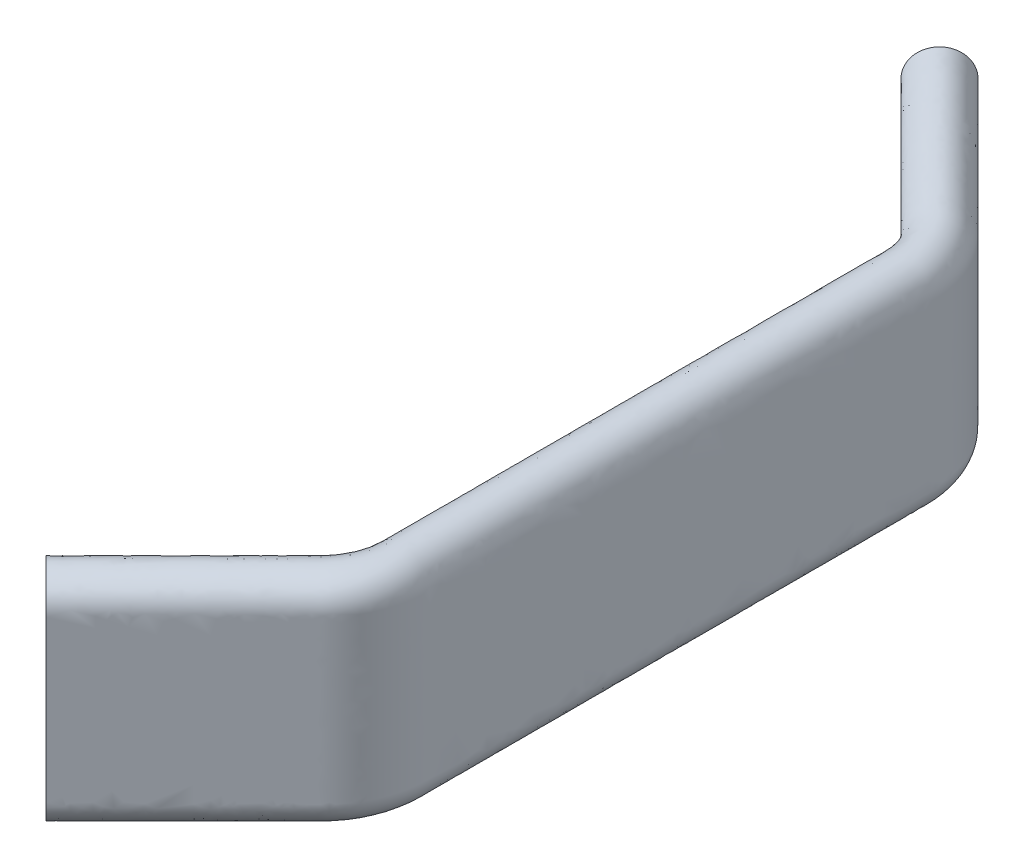
ISO-10303-21;
HEADER;
FILE_DESCRIPTION(('STEP AP214'),'2;1');
FILE_NAME('part.step','',(''),(''),'','','');
FILE_SCHEMA(('AUTOMOTIVE_DESIGN { 1 0 10303 214 1 1 1 1 }'));
ENDSEC;
DATA;
#1=APPLICATION_CONTEXT('core data for automotive mechanical design processes');
#2=APPLICATION_PROTOCOL_DEFINITION('international standard','automotive_design',2000,#1);
#3=PRODUCT_CONTEXT('',#1,'mechanical');
#4=PRODUCT('Part','Part','',(#3));
#5=PRODUCT_RELATED_PRODUCT_CATEGORY('part','',(#4));
#6=PRODUCT_DEFINITION_FORMATION('','',#4);
#7=PRODUCT_DEFINITION_CONTEXT('part definition',#1,'design');
#8=PRODUCT_DEFINITION('design','',#6,#7);
#9=PRODUCT_DEFINITION_SHAPE('','',#8);
#10=(LENGTH_UNIT() NAMED_UNIT(*) SI_UNIT(.MILLI.,.METRE.));
#11=(NAMED_UNIT(*) PLANE_ANGLE_UNIT() SI_UNIT($,.RADIAN.));
#12=(NAMED_UNIT(*) SI_UNIT($,.STERADIAN.) SOLID_ANGLE_UNIT());
#13=UNCERTAINTY_MEASURE_WITH_UNIT(LENGTH_MEASURE(1.E-05),#10,'distance_accuracy_value','');
#14=(GEOMETRIC_REPRESENTATION_CONTEXT(3) GLOBAL_UNCERTAINTY_ASSIGNED_CONTEXT((#13)) GLOBAL_UNIT_ASSIGNED_CONTEXT((#10,
#11,#12)) REPRESENTATION_CONTEXT('',''));
#15=CARTESIAN_POINT('',(0.,0.,0.));
#16=DIRECTION('',(0.,0.,1.));
#17=DIRECTION('',(1.,0.,0.));
#18=AXIS2_PLACEMENT_3D('',#15,#16,#17);
#19=CARTESIAN_POINT('',(1595.46445851633,1338.,-425.606601717802));
#20=DIRECTION('',(0.707106781186548,0.,0.707106781186548));
#21=DIRECTION('',(0.707106781186548,0.,-0.707106781186548));
#22=AXIS2_PLACEMENT_3D('',#19,#20,#21);
#23=PLANE('',#22);
#24=CARTESIAN_POINT('',(1588.39339070446,1308.,-418.535533905937));
#25=CARTESIAN_POINT('',(1588.39339070446,1318.,-418.535533905937));
#26=CARTESIAN_POINT('',(1588.39339070446,1328.,-418.535533905937));
#27=CARTESIAN_POINT('',(1588.39339070446,1338.,-418.535533905937));
#28=CARTESIAN_POINT('',(1588.39339070446,1339.308996939,-418.535533905937));
#29=CARTESIAN_POINT('',(1589.15843914151,1341.91805812446,-419.300582342983));
#30=CARTESIAN_POINT('',(1591.9289246104,1343.54097093777,-422.07106781187));
#31=CARTESIAN_POINT('',(1594.69941007928,1341.91805812446,-424.841553280756));
#32=CARTESIAN_POINT('',(1595.46445851633,1339.308996939,-425.606601717802));
#33=CARTESIAN_POINT('',(1595.46445851633,1338.,-425.606601717802));
#34=CARTESIAN_POINT('',(1595.46445851633,1328.,-425.606601717802));
#35=CARTESIAN_POINT('',(1595.46445851633,1318.,-425.606601717802));
#36=CARTESIAN_POINT('',(1595.46445851633,1308.,-425.606601717802));
#37=CARTESIAN_POINT('',(1595.46445851633,1306.69100306101,-425.606601717802));
#38=CARTESIAN_POINT('',(1594.69941007928,1304.08194187554,-424.841553280755));
#39=CARTESIAN_POINT('',(1591.9289246104,1302.45902906223,-422.07106781187));
#40=CARTESIAN_POINT('',(1589.15843914151,1304.08194187554,-419.300582342983));
#41=CARTESIAN_POINT('',(1588.39339070446,1306.69100306101,-418.535533905937));
#42=CARTESIAN_POINT('',(1588.39339070446,1308.,-418.535533905937));
#43=B_SPLINE_CURVE_WITH_KNOTS('',3,(#24,#25,#26,#27,#28,#29,#30,#31,#32,#33,#34,#35,#36,#37,#38,
#39,#40,#41,#42),.UNSPECIFIED.,.T.,.F.,(4,3,1,1,1,3,3,1,1,1,4),(0.,0.3281703871176,
0.3711277903382,0.4140851935588,0.4570425967794,0.5,0.8281703871176,0.8711277903382,
0.9140851935588,0.9570425967794,1.),.UNSPECIFIED.);
#44=CARTESIAN_POINT('',(1588.39339070446,1308.,-418.535533905937));
#45=VERTEX_POINT('',#44);
#46=EDGE_CURVE('E24',#45,#45,#43,.T.);
#47=ORIENTED_EDGE('',*,*,#46,.T.);
#48=EDGE_LOOP('',(#47));
#49=FACE_BOUND('',#48,.T.);
#50=ADVANCED_FACE('F15',(#49),#23,.F.);
#51=CARTESIAN_POINT('',(1595.46445851633,1338.,-254.393398282202));
#52=DIRECTION('',(-0.707106781186548,0.,0.707106781186548));
#53=DIRECTION('',(0.707106781186548,0.,0.707106781186548));
#54=AXIS2_PLACEMENT_3D('',#51,#52,#53);
#55=PLANE('',#54);
#56=CARTESIAN_POINT('',(1588.39339070446,1308.,-261.464466094068));
#57=CARTESIAN_POINT('',(1588.39339070446,1318.,-261.464466094068));
#58=CARTESIAN_POINT('',(1588.39339070446,1328.,-261.464466094068));
#59=CARTESIAN_POINT('',(1588.39339070446,1338.,-261.464466094068));
#60=CARTESIAN_POINT('',(1588.39339070446,1339.308996939,-261.464466094068));
#61=CARTESIAN_POINT('',(1589.15843914151,1341.91805812446,-260.699417657021));
#62=CARTESIAN_POINT('',(1591.9289246104,1343.54097093777,-257.928932188135));
#63=CARTESIAN_POINT('',(1594.69941007929,1341.91805812446,-255.158446719249));
#64=CARTESIAN_POINT('',(1595.46445851633,1339.308996939,-254.393398282202));
#65=CARTESIAN_POINT('',(1595.46445851633,1338.,-254.393398282202));
#66=CARTESIAN_POINT('',(1595.46445851633,1328.,-254.393398282202));
#67=CARTESIAN_POINT('',(1595.46445851633,1318.,-254.393398282202));
#68=CARTESIAN_POINT('',(1595.46445851633,1308.,-254.393398282202));
#69=CARTESIAN_POINT('',(1595.46445851633,1306.69100306101,-254.393398282202));
#70=CARTESIAN_POINT('',(1594.69941007929,1304.08194187554,-255.158446719249));
#71=CARTESIAN_POINT('',(1591.9289246104,1302.45902906223,-257.928932188135));
#72=CARTESIAN_POINT('',(1589.15843914151,1304.08194187554,-260.699417657021));
#73=CARTESIAN_POINT('',(1588.39339070446,1306.69100306101,-261.464466094068));
#74=CARTESIAN_POINT('',(1588.39339070446,1308.,-261.464466094068));
#75=B_SPLINE_CURVE_WITH_KNOTS('',3,(#56,#57,#58,#59,#60,#61,#62,#63,#64,#65,#66,#67,#68,#69,#70,
#71,#72,#73,#74),.UNSPECIFIED.,.T.,.F.,(4,3,1,1,1,3,3,1,1,1,4),(0.,0.3281703871176,
0.3711277903382,0.4140851935588,0.4570425967794,0.5,0.8281703871176,0.8711277903382,
0.9140851935588,0.9570425967794,1.),.UNSPECIFIED.);
#76=CARTESIAN_POINT('',(1588.39339070446,1308.,-261.464466094068));
#77=VERTEX_POINT('',#76);
#78=EDGE_CURVE('E10',#77,#77,#75,.F.);
#79=ORIENTED_EDGE('',*,*,#78,.T.);
#80=EDGE_LOOP('',(#79));
#81=FACE_BOUND('',#80,.T.);
#82=ADVANCED_FACE('F17',(#81),#55,.T.);
#83=CARTESIAN_POINT('',(1588.39339070446,1308.,-418.535533905937));
#84=CARTESIAN_POINT('',(1596.78594721435,1308.,-410.142977396048));
#85=CARTESIAN_POINT('',(1605.17850372424,1308.,-401.750420886159));
#86=CARTESIAN_POINT('',(1613.57106023413,1308.,-393.35786437627));
#87=CARTESIAN_POINT('',(1614.03311615497,1308.,-392.895808455431));
#88=CARTESIAN_POINT('',(1614.86863115568,1308.,-391.878006064304));
#89=CARTESIAN_POINT('',(1615.79824988906,1308.,-390.138260913584));
#90=CARTESIAN_POINT('',(1616.37109577238,1308.,-388.250735609691));
#91=CARTESIAN_POINT('',(1616.49999242226,1308.,-386.940242314225));
#92=CARTESIAN_POINT('',(1616.49999242226,1308.,-386.286796564404));
#93=CARTESIAN_POINT('',(1616.49999242226,1308.,-355.428932188135));
#94=CARTESIAN_POINT('',(1616.49999242226,1308.,-324.571067811866));
#95=CARTESIAN_POINT('',(1616.49999242226,1308.,-293.713203435597));
#96=CARTESIAN_POINT('',(1616.49999242226,1308.,-293.059757685768));
#97=CARTESIAN_POINT('',(1616.37109577238,1308.,-291.749264390316));
#98=CARTESIAN_POINT('',(1615.79824988906,1308.,-289.861739086415));
#99=CARTESIAN_POINT('',(1614.86863115568,1308.,-288.121993935699));
#100=CARTESIAN_POINT('',(1614.03311615497,1308.,-287.104191544571));
#101=CARTESIAN_POINT('',(1613.57106023413,1308.,-286.642135623732));
#102=CARTESIAN_POINT('',(1605.17850372424,1308.,-278.249579113844));
#103=CARTESIAN_POINT('',(1596.78594721436,1308.,-269.857022603956));
#104=CARTESIAN_POINT('',(1588.39339070446,1308.,-261.464466094068));
#105=CARTESIAN_POINT('',(1588.39339070446,1318.,-418.535533905937));
#106=CARTESIAN_POINT('',(1596.78594721435,1318.,-410.142977396048));
#107=CARTESIAN_POINT('',(1605.17850372424,1318.,-401.750420886159));
#108=CARTESIAN_POINT('',(1613.57106023413,1318.,-393.35786437627));
#109=CARTESIAN_POINT('',(1614.03311615497,1318.,-392.895808455429));
#110=CARTESIAN_POINT('',(1614.86863115568,1318.,-391.878006064304));
#111=CARTESIAN_POINT('',(1615.79824988906,1318.,-390.138260913584));
#112=CARTESIAN_POINT('',(1616.37109577238,1318.,-388.25073560969));
#113=CARTESIAN_POINT('',(1616.49999242226,1318.,-386.940242314227));
#114=CARTESIAN_POINT('',(1616.49999242226,1318.,-386.286796564404));
#115=CARTESIAN_POINT('',(1616.49999242226,1318.,-355.428932188135));
#116=CARTESIAN_POINT('',(1616.49999242226,1318.,-324.571067811866));
#117=CARTESIAN_POINT('',(1616.49999242226,1318.,-293.713203435597));
#118=CARTESIAN_POINT('',(1616.49999242226,1318.,-293.059757685769));
#119=CARTESIAN_POINT('',(1616.37109577238,1318.,-291.749264390315));
#120=CARTESIAN_POINT('',(1615.79824988906,1318.,-289.861739086415));
#121=CARTESIAN_POINT('',(1614.86863115568,1318.,-288.121993935699));
#122=CARTESIAN_POINT('',(1614.03311615497,1318.,-287.104191544571));
#123=CARTESIAN_POINT('',(1613.57106023413,1318.,-286.642135623732));
#124=CARTESIAN_POINT('',(1605.17850372424,1318.,-278.249579113844));
#125=CARTESIAN_POINT('',(1596.78594721436,1318.,-269.857022603956));
#126=CARTESIAN_POINT('',(1588.39339070446,1318.,-261.464466094068));
#127=CARTESIAN_POINT('',(1588.39339070446,1328.,-418.535533905937));
#128=CARTESIAN_POINT('',(1596.78594721435,1328.,-410.142977396048));
#129=CARTESIAN_POINT('',(1605.17850372424,1328.,-401.750420886159));
#130=CARTESIAN_POINT('',(1613.57106023413,1328.,-393.35786437627));
#131=CARTESIAN_POINT('',(1614.03311615497,1328.,-392.895808455427));
#132=CARTESIAN_POINT('',(1614.86863115568,1328.,-391.878006064305));
#133=CARTESIAN_POINT('',(1615.79824988906,1328.,-390.138260913584));
#134=CARTESIAN_POINT('',(1616.37109577238,1328.,-388.250735609689));
#135=CARTESIAN_POINT('',(1616.49999242226,1328.,-386.94024231423));
#136=CARTESIAN_POINT('',(1616.49999242226,1328.,-386.286796564404));
#137=CARTESIAN_POINT('',(1616.49999242226,1328.,-355.428932188135));
#138=CARTESIAN_POINT('',(1616.49999242226,1328.,-324.571067811866));
#139=CARTESIAN_POINT('',(1616.49999242226,1328.,-293.713203435597));
#140=CARTESIAN_POINT('',(1616.49999242226,1328.,-293.05975768577));
#141=CARTESIAN_POINT('',(1616.37109577238,1328.,-291.749264390314));
#142=CARTESIAN_POINT('',(1615.79824988906,1328.,-289.861739086416));
#143=CARTESIAN_POINT('',(1614.86863115568,1328.,-288.121993935698));
#144=CARTESIAN_POINT('',(1614.03311615497,1328.,-287.104191544571));
#145=CARTESIAN_POINT('',(1613.57106023413,1328.,-286.642135623732));
#146=CARTESIAN_POINT('',(1605.17850372424,1328.,-278.249579113844));
#147=CARTESIAN_POINT('',(1596.78594721436,1328.,-269.857022603956));
#148=CARTESIAN_POINT('',(1588.39339070446,1328.,-261.464466094068));
#149=CARTESIAN_POINT('',(1588.39339070446,1338.,-418.535533905937));
#150=CARTESIAN_POINT('',(1596.78594721435,1338.,-410.142977396048));
#151=CARTESIAN_POINT('',(1605.17850372424,1338.,-401.750420886159));
#152=CARTESIAN_POINT('',(1613.57106023413,1338.,-393.35786437627));
#153=CARTESIAN_POINT('',(1614.03311615497,1338.,-392.895808455427));
#154=CARTESIAN_POINT('',(1614.86863115568,1338.,-391.878006064306));
#155=CARTESIAN_POINT('',(1615.79824988906,1338.,-390.138260913584));
#156=CARTESIAN_POINT('',(1616.37109577238,1338.,-388.250735609688));
#157=CARTESIAN_POINT('',(1616.49999242226,1338.,-386.940242314232));
#158=CARTESIAN_POINT('',(1616.49999242226,1338.,-386.286796564404));
#159=CARTESIAN_POINT('',(1616.49999242226,1338.,-355.428932188135));
#160=CARTESIAN_POINT('',(1616.49999242226,1338.,-324.571067811866));
#161=CARTESIAN_POINT('',(1616.49999242226,1338.,-293.713203435597));
#162=CARTESIAN_POINT('',(1616.49999242226,1338.,-293.05975768577));
#163=CARTESIAN_POINT('',(1616.37109577238,1338.,-291.749264390313));
#164=CARTESIAN_POINT('',(1615.79824988906,1338.,-289.861739086417));
#165=CARTESIAN_POINT('',(1614.86863115568,1338.,-288.121993935698));
#166=CARTESIAN_POINT('',(1614.03311615497,1338.,-287.104191544571));
#167=CARTESIAN_POINT('',(1613.57106023413,1338.,-286.642135623732));
#168=CARTESIAN_POINT('',(1605.17850372424,1338.,-278.249579113844));
#169=CARTESIAN_POINT('',(1596.78594721436,1338.,-269.857022603955));
#170=CARTESIAN_POINT('',(1588.39339070446,1338.,-261.464466094068));
#171=CARTESIAN_POINT('',(1588.39339070446,1339.308996939,-418.535533905937));
#172=CARTESIAN_POINT('',(1596.78594721435,1339.308996939,-410.142977396048));
#173=CARTESIAN_POINT('',(1605.17850372424,1339.308996939,-401.750420886159));
#174=CARTESIAN_POINT('',(1613.57106023413,1339.308996939,-393.35786437627));
#175=CARTESIAN_POINT('',(1614.03311615497,1339.308996939,-392.895808455427));
#176=CARTESIAN_POINT('',(1614.86863115568,1339.308996939,-391.878006064306));
#177=CARTESIAN_POINT('',(1615.79824988906,1339.308996939,-390.138260913584));
#178=CARTESIAN_POINT('',(1616.37109577238,1339.308996939,-388.250735609687));
#179=CARTESIAN_POINT('',(1616.49999242226,1339.308996939,-386.940242314232));
#180=CARTESIAN_POINT('',(1616.49999242226,1339.308996939,-386.286796564404));
#181=CARTESIAN_POINT('',(1616.49999242226,1339.308996939,-355.428932188135));
#182=CARTESIAN_POINT('',(1616.49999242226,1339.308996939,-324.571067811866));
#183=CARTESIAN_POINT('',(1616.49999242226,1339.308996939,-293.713203435597));
#184=CARTESIAN_POINT('',(1616.49999242226,1339.308996939,-293.05975768577));
#185=CARTESIAN_POINT('',(1616.37109577238,1339.308996939,-291.749264390313));
#186=CARTESIAN_POINT('',(1615.79824988906,1339.308996939,-289.861739086417));
#187=CARTESIAN_POINT('',(1614.86863115568,1339.308996939,-288.121993935698));
#188=CARTESIAN_POINT('',(1614.03311615497,1339.308996939,-287.104191544571));
#189=CARTESIAN_POINT('',(1613.57106023413,1339.308996939,-286.642135623732));
#190=CARTESIAN_POINT('',(1605.17850372424,1339.308996939,-278.249579113844));
#191=CARTESIAN_POINT('',(1596.78594721436,1339.308996939,-269.857022603955));
#192=CARTESIAN_POINT('',(1588.39339070446,1339.308996939,-261.464466094068));
#193=CARTESIAN_POINT('',(1589.15843914151,1341.91805812446,-419.300582342983));
#194=CARTESIAN_POINT('',(1597.5509956514,1341.91805812446,-410.908025833094));
#195=CARTESIAN_POINT('',(1605.94355216129,1341.91805812446,-402.515469323206));
#196=CARTESIAN_POINT('',(1614.33610867117,1341.91805812446,-394.122912813317));
#197=CARTESIAN_POINT('',(1614.84839797144,1341.91805812446,-393.610623513052));
#198=CARTESIAN_POINT('',(1615.77395741614,1341.91805812446,-392.483041744243));
#199=CARTESIAN_POINT('',(1616.80429746269,1341.91805812446,-390.554979462975));
#200=CARTESIAN_POINT('',(1617.43908294248,1341.91805812446,-388.463073115502));
#201=CARTESIAN_POINT('',(1617.58193429781,1341.91805812446,-387.011283040696));
#202=CARTESIAN_POINT('',(1617.58193429781,1341.91805812446,-386.286796564404));
#203=CARTESIAN_POINT('',(1617.58193429781,1341.91805812446,-355.428932188135));
#204=CARTESIAN_POINT('',(1617.58193429781,1341.91805812446,-324.571067811866));
#205=CARTESIAN_POINT('',(1617.58193429781,1341.91805812446,-293.713203435597));
#206=CARTESIAN_POINT('',(1617.5819342978,1341.91805812446,-292.988716959309));
#207=CARTESIAN_POINT('',(1617.43908294248,1341.91805812446,-291.536926884497));
#208=CARTESIAN_POINT('',(1616.80429746269,1341.91805812446,-289.445020537027));
#209=CARTESIAN_POINT('',(1615.77395741614,1341.91805812446,-287.51695825576));
#210=CARTESIAN_POINT('',(1614.84839797144,1341.91805812446,-286.389376486946));
#211=CARTESIAN_POINT('',(1614.33610867117,1341.91805812446,-285.877087186685));
#212=CARTESIAN_POINT('',(1605.94355216129,1341.91805812446,-277.484530676797));
#213=CARTESIAN_POINT('',(1597.5509956514,1341.91805812446,-269.091974166909));
#214=CARTESIAN_POINT('',(1589.15843914151,1341.91805812446,-260.699417657021));
#215=CARTESIAN_POINT('',(1591.9289246104,1343.54097093777,-422.07106781187));
#216=CARTESIAN_POINT('',(1600.32148112028,1343.54097093777,-413.678511301981));
#217=CARTESIAN_POINT('',(1608.71403763017,1343.54097093777,-405.285954792092));
#218=CARTESIAN_POINT('',(1617.10659414006,1343.54097093777,-396.893398282203));
#219=CARTESIAN_POINT('',(1617.80079459915,1343.54097093777,-396.199197823113));
#220=CARTESIAN_POINT('',(1619.05243382071,1343.54097093777,-394.674069760582));
#221=CARTESIAN_POINT('',(1620.44751800766,1343.54097093777,-392.064050823423));
#222=CARTESIAN_POINT('',(1621.30660660824,1343.54097093777,-389.23201524501));
#223=CARTESIAN_POINT('',(1621.49999242226,1343.54097093777,-387.268544268656));
#224=CARTESIAN_POINT('',(1621.49999242226,1343.54097093777,-386.286796564404));
#225=CARTESIAN_POINT('',(1621.49999242226,1343.54097093777,-355.428932188135));
#226=CARTESIAN_POINT('',(1621.49999242226,1343.54097093777,-324.571067811866));
#227=CARTESIAN_POINT('',(1621.49999242226,1343.54097093777,-293.713203435598));
#228=CARTESIAN_POINT('',(1621.49999242226,1343.54097093777,-292.731455731351));
#229=CARTESIAN_POINT('',(1621.30660660824,1343.54097093777,-290.767984754987));
#230=CARTESIAN_POINT('',(1620.44751800766,1343.54097093777,-287.93594917658));
#231=CARTESIAN_POINT('',(1619.05243382071,1343.54097093777,-285.32593023942));
#232=CARTESIAN_POINT('',(1617.80079459915,1343.54097093777,-283.800802176886));
#233=CARTESIAN_POINT('',(1617.10659414006,1343.54097093777,-283.106601717799));
#234=CARTESIAN_POINT('',(1608.71403763017,1343.54097093777,-274.714045207911));
#235=CARTESIAN_POINT('',(1600.32148112028,1343.54097093777,-266.321488698023));
#236=CARTESIAN_POINT('',(1591.9289246104,1343.54097093777,-257.928932188135));
#237=CARTESIAN_POINT('',(1594.69941007928,1341.91805812446,-424.841553280756));
#238=CARTESIAN_POINT('',(1603.09196658917,1341.91805812446,-416.448996770867));
#239=CARTESIAN_POINT('',(1611.48452309906,1341.91805812446,-408.056440260978));
#240=CARTESIAN_POINT('',(1619.87707960895,1341.91805812446,-399.663883751089));
#241=CARTESIAN_POINT('',(1620.75319122686,1341.91805812446,-398.787772133174));
#242=CARTESIAN_POINT('',(1622.33091022528,1341.91805812446,-396.865097776919));
#243=CARTESIAN_POINT('',(1624.09073855265,1341.91805812446,-393.573122183871));
#244=CARTESIAN_POINT('',(1625.17413027399,1341.91805812446,-390.000957374519));
#245=CARTESIAN_POINT('',(1625.41805054672,1341.91805812446,-387.525805496615));
#246=CARTESIAN_POINT('',(1625.41805054672,1341.91805812446,-386.286796564404));
#247=CARTESIAN_POINT('',(1625.41805054672,1341.91805812446,-355.428932188135));
#248=CARTESIAN_POINT('',(1625.41805054672,1341.91805812446,-324.571067811866));
#249=CARTESIAN_POINT('',(1625.41805054672,1341.91805812446,-293.713203435597));
#250=CARTESIAN_POINT('',(1625.41805054672,1341.91805812446,-292.474194503394));
#251=CARTESIAN_POINT('',(1625.17413027399,1341.91805812446,-289.999042625476));
#252=CARTESIAN_POINT('',(1624.09073855265,1341.91805812446,-286.426877816133));
#253=CARTESIAN_POINT('',(1622.33091022528,1341.91805812446,-283.134902223081));
#254=CARTESIAN_POINT('',(1620.75319122686,1341.91805812446,-281.212227866825));
#255=CARTESIAN_POINT('',(1619.87707960895,1341.91805812446,-280.336116248912));
#256=CARTESIAN_POINT('',(1611.48452309906,1341.91805812446,-271.943559739025));
#257=CARTESIAN_POINT('',(1603.09196658917,1341.91805812446,-263.551003229137));
#258=CARTESIAN_POINT('',(1594.69941007929,1341.91805812446,-255.158446719249));
#259=CARTESIAN_POINT('',(1595.46445851633,1339.308996939,-425.606601717802));
#260=CARTESIAN_POINT('',(1603.85701502622,1339.308996939,-417.214045207914));
#261=CARTESIAN_POINT('',(1612.2495715361,1339.308996939,-408.821488698025));
#262=CARTESIAN_POINT('',(1620.642128046,1339.308996939,-400.428932188136));
#263=CARTESIAN_POINT('',(1621.56847304333,1339.308996939,-399.5025871908));
#264=CARTESIAN_POINT('',(1623.23623648575,1339.308996939,-397.470133456857));
#265=CARTESIAN_POINT('',(1625.09678612627,1339.308996939,-393.989840733261));
#266=CARTESIAN_POINT('',(1626.2421174441,1339.308996939,-390.213294880335));
#267=CARTESIAN_POINT('',(1626.49999242226,1339.308996939,-387.596846223077));
#268=CARTESIAN_POINT('',(1626.49999242226,1339.308996939,-386.286796564404));
#269=CARTESIAN_POINT('',(1626.49999242226,1339.308996939,-355.428932188135));
#270=CARTESIAN_POINT('',(1626.49999242226,1339.308996939,-324.571067811866));
#271=CARTESIAN_POINT('',(1626.49999242226,1339.308996939,-293.713203435597));
#272=CARTESIAN_POINT('',(1626.49999242226,1339.308996939,-292.403153776932));
#273=CARTESIAN_POINT('',(1626.2421174441,1339.308996939,-289.786705119661));
#274=CARTESIAN_POINT('',(1625.09678612627,1339.308996939,-286.010159266742));
#275=CARTESIAN_POINT('',(1623.23623648575,1339.308996939,-282.529866543143));
#276=CARTESIAN_POINT('',(1621.56847304333,1339.308996939,-280.497412809201));
#277=CARTESIAN_POINT('',(1620.642128046,1339.308996939,-279.571067811865));
#278=CARTESIAN_POINT('',(1612.24957153611,1339.308996939,-271.178511301978));
#279=CARTESIAN_POINT('',(1603.85701502622,1339.308996939,-262.78595479209));
#280=CARTESIAN_POINT('',(1595.46445851633,1339.308996939,-254.393398282202));
#281=CARTESIAN_POINT('',(1595.46445851633,1338.,-425.606601717802));
#282=CARTESIAN_POINT('',(1603.85701502622,1338.,-417.214045207914));
#283=CARTESIAN_POINT('',(1612.2495715361,1338.,-408.821488698025));
#284=CARTESIAN_POINT('',(1620.642128046,1338.,-400.428932188136));
#285=CARTESIAN_POINT('',(1621.56847304333,1338.,-399.5025871908));
#286=CARTESIAN_POINT('',(1623.23623648575,1338.,-397.470133456857));
#287=CARTESIAN_POINT('',(1625.09678612627,1338.,-393.989840733261));
#288=CARTESIAN_POINT('',(1626.2421174441,1338.,-390.213294880335));
#289=CARTESIAN_POINT('',(1626.49999242226,1338.,-387.596846223077));
#290=CARTESIAN_POINT('',(1626.49999242226,1338.,-386.286796564404));
#291=CARTESIAN_POINT('',(1626.49999242226,1338.,-355.428932188135));
#292=CARTESIAN_POINT('',(1626.49999242226,1338.,-324.571067811866));
#293=CARTESIAN_POINT('',(1626.49999242226,1338.,-293.713203435597));
#294=CARTESIAN_POINT('',(1626.49999242226,1338.,-292.403153776932));
#295=CARTESIAN_POINT('',(1626.2421174441,1338.,-289.786705119661));
#296=CARTESIAN_POINT('',(1625.09678612627,1338.,-286.010159266742));
#297=CARTESIAN_POINT('',(1623.23623648575,1338.,-282.529866543143));
#298=CARTESIAN_POINT('',(1621.56847304333,1338.,-280.497412809201));
#299=CARTESIAN_POINT('',(1620.642128046,1338.,-279.571067811865));
#300=CARTESIAN_POINT('',(1612.24957153611,1338.,-271.178511301978));
#301=CARTESIAN_POINT('',(1603.85701502622,1338.,-262.78595479209));
#302=CARTESIAN_POINT('',(1595.46445851633,1338.,-254.393398282202));
#303=CARTESIAN_POINT('',(1595.46445851633,1328.,-425.606601717802));
#304=CARTESIAN_POINT('',(1603.85701502622,1328.,-417.214045207914));
#305=CARTESIAN_POINT('',(1612.2495715361,1328.,-408.821488698025));
#306=CARTESIAN_POINT('',(1620.642128046,1328.,-400.428932188136));
#307=CARTESIAN_POINT('',(1621.56847304333,1328.,-399.502587190801));
#308=CARTESIAN_POINT('',(1623.23623648575,1328.,-397.470133456857));
#309=CARTESIAN_POINT('',(1625.09678612627,1328.,-393.989840733261));
#310=CARTESIAN_POINT('',(1626.2421174441,1328.,-390.213294880336));
#311=CARTESIAN_POINT('',(1626.49999242226,1328.,-387.596846223075));
#312=CARTESIAN_POINT('',(1626.49999242226,1328.,-386.286796564404));
#313=CARTESIAN_POINT('',(1626.49999242226,1328.,-355.428932188135));
#314=CARTESIAN_POINT('',(1626.49999242226,1328.,-324.571067811866));
#315=CARTESIAN_POINT('',(1626.49999242226,1328.,-293.713203435598));
#316=CARTESIAN_POINT('',(1626.49999242226,1328.,-292.403153776932));
#317=CARTESIAN_POINT('',(1626.24211744409,1328.,-289.786705119662));
#318=CARTESIAN_POINT('',(1625.09678612627,1328.,-286.010159266741));
#319=CARTESIAN_POINT('',(1623.23623648575,1328.,-282.529866543144));
#320=CARTESIAN_POINT('',(1621.56847304333,1328.,-280.497412809201));
#321=CARTESIAN_POINT('',(1620.642128046,1328.,-279.571067811866));
#322=CARTESIAN_POINT('',(1612.2495715361,1328.,-271.178511301979));
#323=CARTESIAN_POINT('',(1603.85701502622,1328.,-262.78595479209));
#324=CARTESIAN_POINT('',(1595.46445851633,1328.,-254.393398282202));
#325=CARTESIAN_POINT('',(1595.46445851633,1318.,-425.606601717802));
#326=CARTESIAN_POINT('',(1603.85701502622,1318.,-417.214045207914));
#327=CARTESIAN_POINT('',(1612.2495715361,1318.,-408.821488698025));
#328=CARTESIAN_POINT('',(1620.642128046,1318.,-400.428932188136));
#329=CARTESIAN_POINT('',(1621.56847304333,1318.,-399.502587190803));
#330=CARTESIAN_POINT('',(1623.23623648575,1318.,-397.470133456856));
#331=CARTESIAN_POINT('',(1625.09678612627,1318.,-393.989840733261));
#332=CARTESIAN_POINT('',(1626.2421174441,1318.,-390.213294880337));
#333=CARTESIAN_POINT('',(1626.49999242226,1318.,-387.596846223072));
#334=CARTESIAN_POINT('',(1626.49999242226,1318.,-386.286796564404));
#335=CARTESIAN_POINT('',(1626.49999242226,1318.,-355.428932188135));
#336=CARTESIAN_POINT('',(1626.49999242226,1318.,-324.571067811866));
#337=CARTESIAN_POINT('',(1626.49999242226,1318.,-293.713203435598));
#338=CARTESIAN_POINT('',(1626.49999242226,1318.,-292.403153776931));
#339=CARTESIAN_POINT('',(1626.24211744409,1318.,-289.786705119663));
#340=CARTESIAN_POINT('',(1625.09678612627,1318.,-286.010159266741));
#341=CARTESIAN_POINT('',(1623.23623648575,1318.,-282.529866543144));
#342=CARTESIAN_POINT('',(1621.56847304333,1318.,-280.497412809201));
#343=CARTESIAN_POINT('',(1620.642128046,1318.,-279.571067811866));
#344=CARTESIAN_POINT('',(1612.2495715361,1318.,-271.178511301979));
#345=CARTESIAN_POINT('',(1603.85701502622,1318.,-262.78595479209));
#346=CARTESIAN_POINT('',(1595.46445851633,1318.,-254.393398282202));
#347=CARTESIAN_POINT('',(1595.46445851633,1308.,-425.606601717802));
#348=CARTESIAN_POINT('',(1603.85701502622,1308.,-417.214045207914));
#349=CARTESIAN_POINT('',(1612.2495715361,1308.,-408.821488698025));
#350=CARTESIAN_POINT('',(1620.642128046,1308.,-400.428932188136));
#351=CARTESIAN_POINT('',(1621.56847304333,1308.,-399.502587190804));
#352=CARTESIAN_POINT('',(1623.23623648575,1308.,-397.470133456855));
#353=CARTESIAN_POINT('',(1625.09678612627,1308.,-393.989840733261));
#354=CARTESIAN_POINT('',(1626.2421174441,1308.,-390.213294880338));
#355=CARTESIAN_POINT('',(1626.49999242226,1308.,-387.59684622307));
#356=CARTESIAN_POINT('',(1626.49999242226,1308.,-386.286796564404));
#357=CARTESIAN_POINT('',(1626.49999242226,1308.,-355.428932188135));
#358=CARTESIAN_POINT('',(1626.49999242226,1308.,-324.571067811866));
#359=CARTESIAN_POINT('',(1626.49999242226,1308.,-293.713203435597));
#360=CARTESIAN_POINT('',(1626.49999242226,1308.,-292.40315377693));
#361=CARTESIAN_POINT('',(1626.2421174441,1308.,-289.786705119664));
#362=CARTESIAN_POINT('',(1625.09678612627,1308.,-286.01015926674));
#363=CARTESIAN_POINT('',(1623.23623648575,1308.,-282.529866543144));
#364=CARTESIAN_POINT('',(1621.56847304333,1308.,-280.497412809201));
#365=CARTESIAN_POINT('',(1620.642128046,1308.,-279.571067811866));
#366=CARTESIAN_POINT('',(1612.24957153611,1308.,-271.178511301978));
#367=CARTESIAN_POINT('',(1603.85701502622,1308.,-262.78595479209));
#368=CARTESIAN_POINT('',(1595.46445851633,1308.,-254.393398282202));
#369=CARTESIAN_POINT('',(1595.46445851633,1306.69100306101,-425.606601717802));
#370=CARTESIAN_POINT('',(1603.85701502622,1306.69100306101,-417.214045207914));
#371=CARTESIAN_POINT('',(1612.2495715361,1306.69100306101,-408.821488698025));
#372=CARTESIAN_POINT('',(1620.642128046,1306.69100306101,-400.428932188136));
#373=CARTESIAN_POINT('',(1621.56847304333,1306.69100306101,-399.502587190804));
#374=CARTESIAN_POINT('',(1623.23623648575,1306.69100306101,-397.470133456855));
#375=CARTESIAN_POINT('',(1625.09678612627,1306.69100306101,-393.989840733261));
#376=CARTESIAN_POINT('',(1626.2421174441,1306.69100306101,-390.213294880338));
#377=CARTESIAN_POINT('',(1626.49999242226,1306.69100306101,-387.59684622307));
#378=CARTESIAN_POINT('',(1626.49999242226,1306.69100306101,-386.286796564404));
#379=CARTESIAN_POINT('',(1626.49999242226,1306.69100306101,-355.428932188135));
#380=CARTESIAN_POINT('',(1626.49999242226,1306.69100306101,-324.571067811866));
#381=CARTESIAN_POINT('',(1626.49999242226,1306.69100306101,-293.713203435598));
#382=CARTESIAN_POINT('',(1626.49999242226,1306.691003061,-292.40315377693));
#383=CARTESIAN_POINT('',(1626.2421174441,1306.69100306101,-289.786705119664));
#384=CARTESIAN_POINT('',(1625.09678612627,1306.69100306101,-286.01015926674));
#385=CARTESIAN_POINT('',(1623.23623648575,1306.69100306101,-282.529866543144));
#386=CARTESIAN_POINT('',(1621.56847304333,1306.69100306101,-280.497412809201));
#387=CARTESIAN_POINT('',(1620.642128046,1306.69100306101,-279.571067811866));
#388=CARTESIAN_POINT('',(1612.24957153611,1306.69100306101,-271.178511301978));
#389=CARTESIAN_POINT('',(1603.85701502622,1306.69100306101,-262.78595479209));
#390=CARTESIAN_POINT('',(1595.46445851633,1306.69100306101,-254.393398282202));
#391=CARTESIAN_POINT('',(1594.69941007928,1304.08194187554,-424.841553280755));
#392=CARTESIAN_POINT('',(1603.09196658917,1304.08194187554,-416.448996770866));
#393=CARTESIAN_POINT('',(1611.48452309906,1304.08194187554,-408.056440260978));
#394=CARTESIAN_POINT('',(1619.87707960895,1304.08194187554,-399.663883751089));
#395=CARTESIAN_POINT('',(1620.75319122686,1304.08194187554,-398.787772133179));
#396=CARTESIAN_POINT('',(1622.33091022528,1304.08194187554,-396.865097776917));
#397=CARTESIAN_POINT('',(1624.09073855265,1304.08194187554,-393.57312218387));
#398=CARTESIAN_POINT('',(1625.17413027399,1304.08194187554,-390.000957374523));
#399=CARTESIAN_POINT('',(1625.41805054672,1304.08194187554,-387.525805496606));
#400=CARTESIAN_POINT('',(1625.41805054672,1304.08194187554,-386.286796564404));
#401=CARTESIAN_POINT('',(1625.41805054672,1304.08194187554,-355.428932188135));
#402=CARTESIAN_POINT('',(1625.41805054672,1304.08194187554,-324.571067811866));
#403=CARTESIAN_POINT('',(1625.41805054672,1304.08194187554,-293.713203435597));
#404=CARTESIAN_POINT('',(1625.41805054672,1304.08194187554,-292.474194503392));
#405=CARTESIAN_POINT('',(1625.17413027399,1304.08194187555,-289.99904262548));
#406=CARTESIAN_POINT('',(1624.09073855265,1304.08194187554,-286.42687781613));
#407=CARTESIAN_POINT('',(1622.33091022528,1304.08194187554,-283.134902223082));
#408=CARTESIAN_POINT('',(1620.75319122686,1304.08194187554,-281.212227866825));
#409=CARTESIAN_POINT('',(1619.87707960895,1304.08194187554,-280.336116248912));
#410=CARTESIAN_POINT('',(1611.48452309906,1304.08194187554,-271.943559739025));
#411=CARTESIAN_POINT('',(1603.09196658917,1304.08194187554,-263.551003229137));
#412=CARTESIAN_POINT('',(1594.69941007929,1304.08194187554,-255.158446719249));
#413=CARTESIAN_POINT('',(1591.9289246104,1302.45902906223,-422.07106781187));
#414=CARTESIAN_POINT('',(1600.32148112028,1302.45902906223,-413.678511301981));
#415=CARTESIAN_POINT('',(1608.71403763017,1302.45902906223,-405.285954792092));
#416=CARTESIAN_POINT('',(1617.10659414006,1302.45902906223,-396.893398282202));
#417=CARTESIAN_POINT('',(1617.80079459915,1302.45902906223,-396.199197823118));
#418=CARTESIAN_POINT('',(1619.05243382071,1302.45902906223,-394.674069760579));
#419=CARTESIAN_POINT('',(1620.44751800766,1302.45902906223,-392.064050823423));
#420=CARTESIAN_POINT('',(1621.30660660824,1302.45902906223,-389.232015245015));
#421=CARTESIAN_POINT('',(1621.49999242226,1302.45902906223,-387.268544268647));
#422=CARTESIAN_POINT('',(1621.49999242226,1302.45902906223,-386.286796564404));
#423=CARTESIAN_POINT('',(1621.49999242226,1302.45902906223,-355.428932188135));
#424=CARTESIAN_POINT('',(1621.49999242226,1302.45902906223,-324.571067811866));
#425=CARTESIAN_POINT('',(1621.49999242226,1302.45902906223,-293.713203435597));
#426=CARTESIAN_POINT('',(1621.49999242226,1302.45902906223,-292.731455731349));
#427=CARTESIAN_POINT('',(1621.30660660824,1302.45902906223,-290.76798475499));
#428=CARTESIAN_POINT('',(1620.44751800766,1302.45902906223,-287.935949176577));
#429=CARTESIAN_POINT('',(1619.05243382071,1302.45902906223,-285.325930239421));
#430=CARTESIAN_POINT('',(1617.80079459915,1302.45902906223,-283.800802176886));
#431=CARTESIAN_POINT('',(1617.10659414006,1302.45902906223,-283.106601717799));
#432=CARTESIAN_POINT('',(1608.71403763017,1302.45902906223,-274.714045207911));
#433=CARTESIAN_POINT('',(1600.32148112028,1302.45902906223,-266.321488698023));
#434=CARTESIAN_POINT('',(1591.9289246104,1302.45902906223,-257.928932188135));
#435=CARTESIAN_POINT('',(1589.15843914151,1304.08194187554,-419.300582342983));
#436=CARTESIAN_POINT('',(1597.5509956514,1304.08194187554,-410.908025833094));
#437=CARTESIAN_POINT('',(1605.94355216128,1304.08194187554,-402.515469323206));
#438=CARTESIAN_POINT('',(1614.33610867117,1304.08194187554,-394.122912813317));
#439=CARTESIAN_POINT('',(1614.84839797143,1304.08194187554,-393.610623513056));
#440=CARTESIAN_POINT('',(1615.77395741614,1304.08194187554,-392.483041744241));
#441=CARTESIAN_POINT('',(1616.80429746269,1304.08194187554,-390.554979462975));
#442=CARTESIAN_POINT('',(1617.43908294247,1304.08194187554,-388.463073115506));
#443=CARTESIAN_POINT('',(1617.58193429781,1304.08194187554,-387.011283040687));
#444=CARTESIAN_POINT('',(1617.58193429781,1304.08194187554,-386.286796564404));
#445=CARTESIAN_POINT('',(1617.58193429781,1304.08194187554,-355.428932188135));
#446=CARTESIAN_POINT('',(1617.58193429781,1304.08194187554,-324.571067811866));
#447=CARTESIAN_POINT('',(1617.58193429781,1304.08194187554,-293.713203435598));
#448=CARTESIAN_POINT('',(1617.5819342978,1304.08194187554,-292.988716959307));
#449=CARTESIAN_POINT('',(1617.43908294248,1304.08194187555,-291.536926884501));
#450=CARTESIAN_POINT('',(1616.80429746269,1304.08194187554,-289.445020537025));
#451=CARTESIAN_POINT('',(1615.77395741614,1304.08194187554,-287.516958255761));
#452=CARTESIAN_POINT('',(1614.84839797144,1304.08194187554,-286.389376486946));
#453=CARTESIAN_POINT('',(1614.33610867117,1304.08194187554,-285.877087186685));
#454=CARTESIAN_POINT('',(1605.94355216129,1304.08194187554,-277.484530676797));
#455=CARTESIAN_POINT('',(1597.5509956514,1304.08194187554,-269.091974166909));
#456=CARTESIAN_POINT('',(1589.15843914151,1304.08194187554,-260.699417657021));
#457=CARTESIAN_POINT('',(1588.39339070446,1306.69100306101,-418.535533905937));
#458=CARTESIAN_POINT('',(1596.78594721435,1306.69100306101,-410.142977396048));
#459=CARTESIAN_POINT('',(1605.17850372424,1306.69100306101,-401.750420886159));
#460=CARTESIAN_POINT('',(1613.57106023413,1306.69100306101,-393.35786437627));
#461=CARTESIAN_POINT('',(1614.03311615497,1306.691003061,-392.895808455431));
#462=CARTESIAN_POINT('',(1614.86863115568,1306.69100306101,-391.878006064304));
#463=CARTESIAN_POINT('',(1615.79824988906,1306.69100306101,-390.138260913584));
#464=CARTESIAN_POINT('',(1616.37109577238,1306.69100306101,-388.250735609691));
#465=CARTESIAN_POINT('',(1616.49999242226,1306.69100306101,-386.940242314225));
#466=CARTESIAN_POINT('',(1616.49999242226,1306.69100306101,-386.286796564404));
#467=CARTESIAN_POINT('',(1616.49999242226,1306.69100306101,-355.428932188135));
#468=CARTESIAN_POINT('',(1616.49999242226,1306.69100306101,-324.571067811866));
#469=CARTESIAN_POINT('',(1616.49999242226,1306.69100306101,-293.713203435598));
#470=CARTESIAN_POINT('',(1616.49999242226,1306.691003061,-293.059757685769));
#471=CARTESIAN_POINT('',(1616.37109577238,1306.69100306101,-291.749264390317));
#472=CARTESIAN_POINT('',(1615.79824988906,1306.69100306101,-289.861739086415));
#473=CARTESIAN_POINT('',(1614.86863115568,1306.69100306101,-288.121993935699));
#474=CARTESIAN_POINT('',(1614.03311615497,1306.69100306101,-287.104191544572));
#475=CARTESIAN_POINT('',(1613.57106023413,1306.69100306101,-286.642135623733));
#476=CARTESIAN_POINT('',(1605.17850372424,1306.69100306101,-278.249579113844));
#477=CARTESIAN_POINT('',(1596.78594721436,1306.69100306101,-269.857022603956));
#478=CARTESIAN_POINT('',(1588.39339070446,1306.69100306101,-261.464466094068));
#479=CARTESIAN_POINT('',(1588.39339070446,1308.,-418.535533905937));
#480=CARTESIAN_POINT('',(1596.78594721435,1308.,-410.142977396048));
#481=CARTESIAN_POINT('',(1605.17850372424,1308.,-401.750420886159));
#482=CARTESIAN_POINT('',(1613.57106023413,1308.,-393.35786437627));
#483=CARTESIAN_POINT('',(1614.03311615497,1308.,-392.895808455431));
#484=CARTESIAN_POINT('',(1614.86863115568,1308.,-391.878006064304));
#485=CARTESIAN_POINT('',(1615.79824988906,1308.,-390.138260913584));
#486=CARTESIAN_POINT('',(1616.37109577238,1308.,-388.250735609691));
#487=CARTESIAN_POINT('',(1616.49999242226,1308.,-386.940242314225));
#488=CARTESIAN_POINT('',(1616.49999242226,1308.,-386.286796564404));
#489=CARTESIAN_POINT('',(1616.49999242226,1308.,-355.428932188135));
#490=CARTESIAN_POINT('',(1616.49999242226,1308.,-324.571067811866));
#491=CARTESIAN_POINT('',(1616.49999242226,1308.,-293.713203435597));
#492=CARTESIAN_POINT('',(1616.49999242226,1308.,-293.059757685768));
#493=CARTESIAN_POINT('',(1616.37109577238,1308.,-291.749264390316));
#494=CARTESIAN_POINT('',(1615.79824988906,1308.,-289.861739086415));
#495=CARTESIAN_POINT('',(1614.86863115568,1308.,-288.121993935699));
#496=CARTESIAN_POINT('',(1614.03311615497,1308.,-287.104191544571));
#497=CARTESIAN_POINT('',(1613.57106023413,1308.,-286.642135623732));
#498=CARTESIAN_POINT('',(1605.17850372424,1308.,-278.249579113844));
#499=CARTESIAN_POINT('',(1596.78594721436,1308.,-269.857022603956));
#500=CARTESIAN_POINT('',(1588.39339070446,1308.,-261.464466094068));
#501=B_SPLINE_SURFACE_WITH_KNOTS('',3,3,((#83,#84,#85,#86,#87,#88,#89,#90,#91,#92,#93,#94,#95,
#96,#97,#98,#99,#100,#101,#102,#103,#104),(#105,#106,#107,#108,#109,#110,#111,#112,#113,#114,
#115,#116,#117,#118,#119,#120,#121,#122,#123,#124,#125,#126),(#127,#128,#129,#130,#131,#132,
#133,#134,#135,#136,#137,#138,#139,#140,#141,#142,#143,#144,#145,#146,#147,#148),(#149,#150,
#151,#152,#153,#154,#155,#156,#157,#158,#159,#160,#161,#162,#163,#164,#165,#166,#167,#168,#169,
#170),(#171,#172,#173,#174,#175,#176,#177,#178,#179,#180,#181,#182,#183,#184,#185,#186,#187,
#188,#189,#190,#191,#192),(#193,#194,#195,#196,#197,#198,#199,#200,#201,#202,#203,#204,#205,
#206,#207,#208,#209,#210,#211,#212,#213,#214),(#215,#216,#217,#218,#219,#220,#221,#222,#223,
#224,#225,#226,#227,#228,#229,#230,#231,#232,#233,#234,#235,#236),(#237,#238,#239,#240,#241,
#242,#243,#244,#245,#246,#247,#248,#249,#250,#251,#252,#253,#254,#255,#256,#257,#258),(#259,
#260,#261,#262,#263,#264,#265,#266,#267,#268,#269,#270,#271,#272,#273,#274,#275,#276,#277,#278,
#279,#280),(#281,#282,#283,#284,#285,#286,#287,#288,#289,#290,#291,#292,#293,#294,#295,#296,
#297,#298,#299,#300,#301,#302),(#303,#304,#305,#306,#307,#308,#309,#310,#311,#312,#313,#314,
#315,#316,#317,#318,#319,#320,#321,#322,#323,#324),(#325,#326,#327,#328,#329,#330,#331,#332,
#333,#334,#335,#336,#337,#338,#339,#340,#341,#342,#343,#344,#345,#346),(#347,#348,#349,#350,
#351,#352,#353,#354,#355,#356,#357,#358,#359,#360,#361,#362,#363,#364,#365,#366,#367,#368),
(#369,#370,#371,#372,#373,#374,#375,#376,#377,#378,#379,#380,#381,#382,#383,#384,#385,#386,#387,
#388,#389,#390),(#391,#392,#393,#394,#395,#396,#397,#398,#399,#400,#401,#402,#403,#404,#405,
#406,#407,#408,#409,#410,#411,#412),(#413,#414,#415,#416,#417,#418,#419,#420,#421,#422,#423,
#424,#425,#426,#427,#428,#429,#430,#431,#432,#433,#434),(#435,#436,#437,#438,#439,#440,#441,
#442,#443,#444,#445,#446,#447,#448,#449,#450,#451,#452,#453,#454,#455,#456),(#457,#458,#459,
#460,#461,#462,#463,#464,#465,#466,#467,#468,#469,#470,#471,#472,#473,#474,#475,#476,#477,#478),
(#479,#480,#481,#482,#483,#484,#485,#486,#487,#488,#489,#490,#491,#492,#493,#494,#495,#496,#497,
#498,#499,#500)),.UNSPECIFIED.,.T.,.F.,.F.,(4,3,1,1,1,3,3,1,1,1,4),(4,3,1,1,1,3,3,1,1,1,3,4),
(0.,0.3281703871176,0.3711277903382,0.4140851935588,0.4570425967794,0.5,0.8281703871176,
0.8711277903382,0.9140851935588,0.9570425967794,1.),(0.,0.0356066017178028,0.0385518448305432,
0.0414970879432836,0.0444423310560241,0.0473875741687645,0.139961167297571,0.142906410410312,
0.145851653523052,0.148796896635793,0.151742139748533,0.187348741466331),.UNSPECIFIED.);
#502=ORIENTED_EDGE('',*,*,#46,.F.);
#503=EDGE_LOOP('',(#502));
#504=FACE_BOUND('',#503,.T.);
#505=ORIENTED_EDGE('',*,*,#78,.F.);
#506=EDGE_LOOP('',(#505));
#507=FACE_BOUND('',#506,.T.);
#508=ADVANCED_FACE('F36',(#504,#507),#501,.F.);
#509=CLOSED_SHELL('',(#50,#82,#508));
#510=MANIFOLD_SOLID_BREP('B1',#509);
#511=ADVANCED_BREP_SHAPE_REPRESENTATION('',(#18,#510),#14);
#512=SHAPE_DEFINITION_REPRESENTATION(#9,#511);
ENDSEC;
END-ISO-10303-21;
